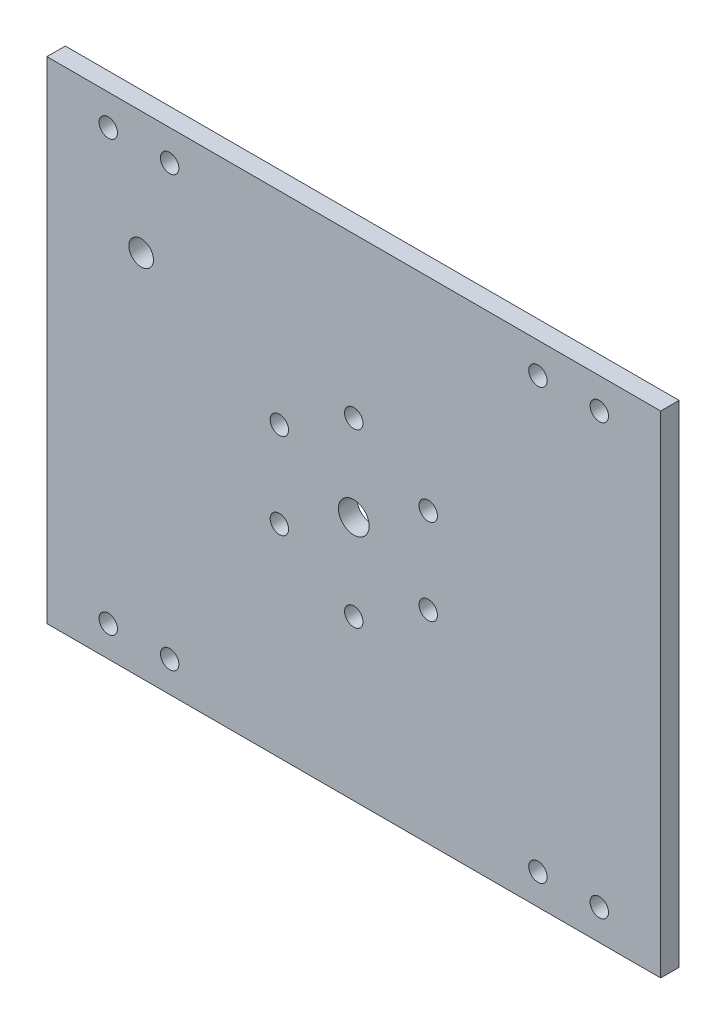
ISO-10303-21;
HEADER;
FILE_DESCRIPTION(('STEP AP214'),'2;1');
FILE_NAME('part.step','',(''),(''),'','','');
FILE_SCHEMA(('AUTOMOTIVE_DESIGN { 1 0 10303 214 1 1 1 1 }'));
ENDSEC;
DATA;
#1=APPLICATION_CONTEXT('core data for automotive mechanical design processes');
#2=APPLICATION_PROTOCOL_DEFINITION('international standard','automotive_design',2000,#1);
#3=PRODUCT_CONTEXT('',#1,'mechanical');
#4=PRODUCT('Part','Part','',(#3));
#5=PRODUCT_RELATED_PRODUCT_CATEGORY('part','',(#4));
#6=PRODUCT_DEFINITION_FORMATION('','',#4);
#7=PRODUCT_DEFINITION_CONTEXT('part definition',#1,'design');
#8=PRODUCT_DEFINITION('design','',#6,#7);
#9=PRODUCT_DEFINITION_SHAPE('','',#8);
#10=(LENGTH_UNIT() NAMED_UNIT(*) SI_UNIT(.MILLI.,.METRE.));
#11=(NAMED_UNIT(*) PLANE_ANGLE_UNIT() SI_UNIT($,.RADIAN.));
#12=(NAMED_UNIT(*) SI_UNIT($,.STERADIAN.) SOLID_ANGLE_UNIT());
#13=UNCERTAINTY_MEASURE_WITH_UNIT(LENGTH_MEASURE(1.E-05),#10,'distance_accuracy_value','');
#14=(GEOMETRIC_REPRESENTATION_CONTEXT(3) GLOBAL_UNCERTAINTY_ASSIGNED_CONTEXT((#13)) GLOBAL_UNIT_ASSIGNED_CONTEXT((#10,
#11,#12)) REPRESENTATION_CONTEXT('',''));
#15=CARTESIAN_POINT('',(0.,0.,0.));
#16=DIRECTION('',(0.,0.,1.));
#17=DIRECTION('',(1.,0.,0.));
#18=AXIS2_PLACEMENT_3D('',#15,#16,#17);
#19=CARTESIAN_POINT('',(0.,0.,3.));
#20=DIRECTION('',(0.,0.,1.));
#21=DIRECTION('',(1.,0.,0.));
#22=AXIS2_PLACEMENT_3D('',#19,#20,#21);
#23=PLANE('',#22);
#24=CARTESIAN_POINT('',(-34.6410161513775,20.0000000000001,3.));
#25=DIRECTION('',(0.,0.,-1.));
#26=DIRECTION('',(-1.,0.,0.));
#27=AXIS2_PLACEMENT_3D('',#24,#25,#26);
#28=CIRCLE('',#27,2.);
#29=CARTESIAN_POINT('',(-36.6410161513775,20.0000000000001,3.));
#30=VERTEX_POINT('',#29);
#31=EDGE_CURVE('E188',#30,#30,#28,.T.);
#32=ORIENTED_EDGE('',*,*,#31,.T.);
#33=EDGE_LOOP('',(#32));
#34=FACE_BOUND('',#33,.T.);
#35=CARTESIAN_POINT('',(30.,35.,3.));
#36=DIRECTION('',(0.,0.,1.));
#37=DIRECTION('',(1.,0.,0.));
#38=AXIS2_PLACEMENT_3D('',#35,#36,#37);
#39=CIRCLE('',#38,1.5);
#40=CARTESIAN_POINT('',(31.5,35.,3.));
#41=VERTEX_POINT('',#40);
#42=EDGE_CURVE('E162',#41,#41,#39,.T.);
#43=ORIENTED_EDGE('',*,*,#42,.F.);
#44=EDGE_LOOP('',(#43));
#45=FACE_BOUND('',#44,.T.);
#46=CARTESIAN_POINT('',(-30.,35.,3.));
#47=DIRECTION('',(0.,0.,1.));
#48=DIRECTION('',(1.,0.,0.));
#49=AXIS2_PLACEMENT_3D('',#46,#47,#48);
#50=CIRCLE('',#49,1.5);
#51=CARTESIAN_POINT('',(-28.5,35.,3.));
#52=VERTEX_POINT('',#51);
#53=EDGE_CURVE('E165',#52,#52,#50,.T.);
#54=ORIENTED_EDGE('',*,*,#53,.F.);
#55=EDGE_LOOP('',(#54));
#56=FACE_BOUND('',#55,.T.);
#57=CARTESIAN_POINT('',(-40.,35.,3.));
#58=DIRECTION('',(0.,0.,1.));
#59=DIRECTION('',(1.,0.,0.));
#60=AXIS2_PLACEMENT_3D('',#57,#58,#59);
#61=CIRCLE('',#60,1.5);
#62=CARTESIAN_POINT('',(-38.5,35.,3.));
#63=VERTEX_POINT('',#62);
#64=EDGE_CURVE('E168',#63,#63,#61,.T.);
#65=ORIENTED_EDGE('',*,*,#64,.F.);
#66=EDGE_LOOP('',(#65));
#67=FACE_BOUND('',#66,.T.);
#68=CARTESIAN_POINT('',(-40.,-35.,3.));
#69=DIRECTION('',(0.,0.,1.));
#70=DIRECTION('',(1.,0.,0.));
#71=AXIS2_PLACEMENT_3D('',#68,#69,#70);
#72=CIRCLE('',#71,1.5);
#73=CARTESIAN_POINT('',(-38.5,-35.,3.));
#74=VERTEX_POINT('',#73);
#75=EDGE_CURVE('E171',#74,#74,#72,.T.);
#76=ORIENTED_EDGE('',*,*,#75,.F.);
#77=EDGE_LOOP('',(#76));
#78=FACE_BOUND('',#77,.T.);
#79=CARTESIAN_POINT('',(-30.,-35.,3.));
#80=DIRECTION('',(0.,0.,1.));
#81=DIRECTION('',(1.,0.,0.));
#82=AXIS2_PLACEMENT_3D('',#79,#80,#81);
#83=CIRCLE('',#82,1.5);
#84=CARTESIAN_POINT('',(-28.5,-35.,3.));
#85=VERTEX_POINT('',#84);
#86=EDGE_CURVE('E174',#85,#85,#83,.T.);
#87=ORIENTED_EDGE('',*,*,#86,.F.);
#88=EDGE_LOOP('',(#87));
#89=FACE_BOUND('',#88,.T.);
#90=CARTESIAN_POINT('',(30.,-35.,3.));
#91=DIRECTION('',(0.,0.,1.));
#92=DIRECTION('',(1.,0.,0.));
#93=AXIS2_PLACEMENT_3D('',#90,#91,#92);
#94=CIRCLE('',#93,1.5);
#95=CARTESIAN_POINT('',(31.5,-35.,3.));
#96=VERTEX_POINT('',#95);
#97=EDGE_CURVE('E177',#96,#96,#94,.T.);
#98=ORIENTED_EDGE('',*,*,#97,.F.);
#99=EDGE_LOOP('',(#98));
#100=FACE_BOUND('',#99,.T.);
#101=CARTESIAN_POINT('',(40.,-35.,3.));
#102=DIRECTION('',(0.,0.,1.));
#103=DIRECTION('',(1.,0.,0.));
#104=AXIS2_PLACEMENT_3D('',#101,#102,#103);
#105=CIRCLE('',#104,1.5);
#106=CARTESIAN_POINT('',(41.5,-35.,3.));
#107=VERTEX_POINT('',#106);
#108=EDGE_CURVE('E180',#107,#107,#105,.T.);
#109=ORIENTED_EDGE('',*,*,#108,.F.);
#110=EDGE_LOOP('',(#109));
#111=FACE_BOUND('',#110,.T.);
#112=CARTESIAN_POINT('',(40.,35.,3.));
#113=DIRECTION('',(0.,0.,1.));
#114=DIRECTION('',(1.,0.,0.));
#115=AXIS2_PLACEMENT_3D('',#112,#113,#114);
#116=CIRCLE('',#115,1.5);
#117=CARTESIAN_POINT('',(41.5,35.,3.));
#118=VERTEX_POINT('',#117);
#119=EDGE_CURVE('E154',#118,#118,#116,.T.);
#120=ORIENTED_EDGE('',*,*,#119,.F.);
#121=EDGE_LOOP('',(#120));
#122=FACE_BOUND('',#121,.T.);
#123=CARTESIAN_POINT('',(-12.1243556529809,-7.00000000000069,3.));
#124=DIRECTION('',(0.,0.,1.));
#125=DIRECTION('',(1.,0.,0.));
#126=AXIS2_PLACEMENT_3D('',#123,#124,#125);
#127=CIRCLE('',#126,1.50000000000147);
#128=CARTESIAN_POINT('',(-10.6243556529795,-7.00000000000069,3.));
#129=VERTEX_POINT('',#128);
#130=EDGE_CURVE('E142',#129,#129,#127,.T.);
#131=ORIENTED_EDGE('',*,*,#130,.F.);
#132=EDGE_LOOP('',(#131));
#133=FACE_BOUND('',#132,.T.);
#134=CARTESIAN_POINT('',(12.1243556529833,-6.99999999999931,3.));
#135=DIRECTION('',(0.,0.,1.));
#136=DIRECTION('',(1.,0.,0.));
#137=AXIS2_PLACEMENT_3D('',#134,#135,#136);
#138=CIRCLE('',#137,1.500000000001);
#139=CARTESIAN_POINT('',(13.6243556529843,-6.99999999999931,3.));
#140=VERTEX_POINT('',#139);
#141=EDGE_CURVE('E130',#140,#140,#138,.T.);
#142=ORIENTED_EDGE('',*,*,#141,.F.);
#143=EDGE_LOOP('',(#142));
#144=FACE_BOUND('',#143,.T.);
#145=CARTESIAN_POINT('',(0.,0.,3.));
#146=DIRECTION('',(0.,0.,1.));
#147=DIRECTION('',(1.,0.,0.));
#148=AXIS2_PLACEMENT_3D('',#145,#146,#147);
#149=CIRCLE('',#148,2.5);
#150=CARTESIAN_POINT('',(2.5,0.,3.));
#151=VERTEX_POINT('',#150);
#152=EDGE_CURVE('E118',#151,#151,#149,.T.);
#153=ORIENTED_EDGE('',*,*,#152,.F.);
#154=EDGE_LOOP('',(#153));
#155=FACE_BOUND('',#154,.T.);
#156=DIRECTION('',(0.,1.,0.));
#157=VECTOR('',#156,1.);
#158=CARTESIAN_POINT('',(50.,40.,3.));
#159=LINE('',#158,#157);
#160=CARTESIAN_POINT('',(50.,-40.,3.));
#161=VERTEX_POINT('',#160);
#162=CARTESIAN_POINT('',(50.,40.,3.));
#163=VERTEX_POINT('',#162);
#164=EDGE_CURVE('E88',#161,#163,#159,.T.);
#165=ORIENTED_EDGE('',*,*,#164,.T.);
#166=DIRECTION('',(-1.,0.,0.));
#167=VECTOR('',#166,1.);
#168=CARTESIAN_POINT('',(-50.,40.,3.));
#169=LINE('',#168,#167);
#170=CARTESIAN_POINT('',(-50.,40.,3.));
#171=VERTEX_POINT('',#170);
#172=EDGE_CURVE('E83',#163,#171,#169,.T.);
#173=ORIENTED_EDGE('',*,*,#172,.T.);
#174=DIRECTION('',(0.,-1.,0.));
#175=VECTOR('',#174,1.);
#176=CARTESIAN_POINT('',(-50.,40.,3.));
#177=LINE('',#176,#175);
#178=CARTESIAN_POINT('',(-50.,-40.,3.));
#179=VERTEX_POINT('',#178);
#180=EDGE_CURVE('E86',#171,#179,#177,.T.);
#181=ORIENTED_EDGE('',*,*,#180,.T.);
#182=DIRECTION('',(1.,0.,0.));
#183=VECTOR('',#182,1.);
#184=CARTESIAN_POINT('',(-50.,-40.,3.));
#185=LINE('',#184,#183);
#186=EDGE_CURVE('E53',#179,#161,#185,.T.);
#187=ORIENTED_EDGE('',*,*,#186,.T.);
#188=EDGE_LOOP('',(#165,#173,#181,#187));
#189=FACE_BOUND('',#188,.T.);
#190=CARTESIAN_POINT('',(0.,14.,3.));
#191=DIRECTION('',(0.,0.,1.));
#192=DIRECTION('',(1.,0.,0.));
#193=AXIS2_PLACEMENT_3D('',#190,#191,#192);
#194=CIRCLE('',#193,1.5);
#195=CARTESIAN_POINT('',(1.5,14.,3.));
#196=VERTEX_POINT('',#195);
#197=EDGE_CURVE('E103',#196,#196,#194,.T.);
#198=ORIENTED_EDGE('',*,*,#197,.F.);
#199=EDGE_LOOP('',(#198));
#200=FACE_BOUND('',#199,.T.);
#201=CARTESIAN_POINT('',(12.1243556529822,6.99999999999997,3.));
#202=DIRECTION('',(0.,0.,1.));
#203=DIRECTION('',(1.,0.,0.));
#204=AXIS2_PLACEMENT_3D('',#201,#202,#203);
#205=CIRCLE('',#204,1.5);
#206=CARTESIAN_POINT('',(13.6243556529822,6.99999999999997,3.));
#207=VERTEX_POINT('',#206);
#208=EDGE_CURVE('E124',#207,#207,#205,.T.);
#209=ORIENTED_EDGE('',*,*,#208,.F.);
#210=EDGE_LOOP('',(#209));
#211=FACE_BOUND('',#210,.T.);
#212=CARTESIAN_POINT('',(1.58818671706501E-12,-14.,3.));
#213=DIRECTION('',(0.,0.,1.));
#214=DIRECTION('',(1.,0.,0.));
#215=AXIS2_PLACEMENT_3D('',#212,#213,#214);
#216=CIRCLE('',#215,1.50000000000161);
#217=CARTESIAN_POINT('',(1.5000000000032,-14.,3.));
#218=VERTEX_POINT('',#217);
#219=EDGE_CURVE('E136',#218,#218,#216,.T.);
#220=ORIENTED_EDGE('',*,*,#219,.F.);
#221=EDGE_LOOP('',(#220));
#222=FACE_BOUND('',#221,.T.);
#223=CARTESIAN_POINT('',(-12.1243556529821,7.00000000000014,3.));
#224=DIRECTION('',(0.,0.,1.));
#225=DIRECTION('',(1.,0.,0.));
#226=AXIS2_PLACEMENT_3D('',#223,#224,#225);
#227=CIRCLE('',#226,1.5);
#228=CARTESIAN_POINT('',(-10.6243556529821,7.00000000000014,3.));
#229=VERTEX_POINT('',#228);
#230=EDGE_CURVE('E148',#229,#229,#227,.T.);
#231=ORIENTED_EDGE('',*,*,#230,.F.);
#232=EDGE_LOOP('',(#231));
#233=FACE_BOUND('',#232,.T.);
#234=ADVANCED_FACE('F36',(#34,#45,#56,#67,#78,#89,#100,#111,#122,#133,#144,#155,#189,#200,#211,
#222,#233),#23,.T.);
#235=CARTESIAN_POINT('',(0.,0.,0.));
#236=DIRECTION('',(0.,0.,1.));
#237=DIRECTION('',(1.,0.,0.));
#238=AXIS2_PLACEMENT_3D('',#235,#236,#237);
#239=PLANE('',#238);
#240=CARTESIAN_POINT('',(-34.6410161513775,20.0000000000001,0.));
#241=DIRECTION('',(0.,0.,-1.));
#242=DIRECTION('',(-1.,0.,0.));
#243=AXIS2_PLACEMENT_3D('',#240,#241,#242);
#244=CIRCLE('',#243,2.);
#245=CARTESIAN_POINT('',(-36.6410161513775,20.0000000000001,0.));
#246=VERTEX_POINT('',#245);
#247=EDGE_CURVE('E205',#246,#246,#244,.T.);
#248=ORIENTED_EDGE('',*,*,#247,.F.);
#249=EDGE_LOOP('',(#248));
#250=FACE_BOUND('',#249,.T.);
#251=CARTESIAN_POINT('',(30.,35.,0.));
#252=DIRECTION('',(0.,0.,-1.));
#253=DIRECTION('',(-1.,0.,0.));
#254=AXIS2_PLACEMENT_3D('',#251,#252,#253);
#255=CIRCLE('',#254,1.5);
#256=CARTESIAN_POINT('',(28.5,35.,0.));
#257=VERTEX_POINT('',#256);
#258=EDGE_CURVE('E183',#257,#257,#255,.T.);
#259=ORIENTED_EDGE('',*,*,#258,.F.);
#260=EDGE_LOOP('',(#259));
#261=FACE_BOUND('',#260,.T.);
#262=CARTESIAN_POINT('',(-30.,35.,0.));
#263=DIRECTION('',(0.,0.,-1.));
#264=DIRECTION('',(1.,0.,0.));
#265=AXIS2_PLACEMENT_3D('',#262,#263,#264);
#266=CIRCLE('',#265,1.5);
#267=CARTESIAN_POINT('',(-28.5,35.,0.));
#268=VERTEX_POINT('',#267);
#269=EDGE_CURVE('E200',#268,#268,#266,.T.);
#270=ORIENTED_EDGE('',*,*,#269,.F.);
#271=EDGE_LOOP('',(#270));
#272=FACE_BOUND('',#271,.T.);
#273=CARTESIAN_POINT('',(-40.,35.,0.));
#274=DIRECTION('',(0.,0.,-1.));
#275=DIRECTION('',(1.,0.,0.));
#276=AXIS2_PLACEMENT_3D('',#273,#274,#275);
#277=CIRCLE('',#276,1.5);
#278=CARTESIAN_POINT('',(-38.5,35.,0.));
#279=VERTEX_POINT('',#278);
#280=EDGE_CURVE('E197',#279,#279,#277,.T.);
#281=ORIENTED_EDGE('',*,*,#280,.F.);
#282=EDGE_LOOP('',(#281));
#283=FACE_BOUND('',#282,.T.);
#284=CARTESIAN_POINT('',(-40.,-35.,0.));
#285=DIRECTION('',(0.,0.,-1.));
#286=DIRECTION('',(-1.,0.,0.));
#287=AXIS2_PLACEMENT_3D('',#284,#285,#286);
#288=CIRCLE('',#287,1.5);
#289=CARTESIAN_POINT('',(-41.5,-35.,0.));
#290=VERTEX_POINT('',#289);
#291=EDGE_CURVE('E194',#290,#290,#288,.T.);
#292=ORIENTED_EDGE('',*,*,#291,.F.);
#293=EDGE_LOOP('',(#292));
#294=FACE_BOUND('',#293,.T.);
#295=CARTESIAN_POINT('',(-30.,-35.,0.));
#296=DIRECTION('',(0.,0.,-1.));
#297=DIRECTION('',(-1.,0.,0.));
#298=AXIS2_PLACEMENT_3D('',#295,#296,#297);
#299=CIRCLE('',#298,1.5);
#300=CARTESIAN_POINT('',(-31.5,-35.,0.));
#301=VERTEX_POINT('',#300);
#302=EDGE_CURVE('E191',#301,#301,#299,.T.);
#303=ORIENTED_EDGE('',*,*,#302,.F.);
#304=EDGE_LOOP('',(#303));
#305=FACE_BOUND('',#304,.T.);
#306=CARTESIAN_POINT('',(30.,-35.,0.));
#307=DIRECTION('',(0.,0.,-1.));
#308=DIRECTION('',(1.,0.,0.));
#309=AXIS2_PLACEMENT_3D('',#306,#307,#308);
#310=CIRCLE('',#309,1.5);
#311=CARTESIAN_POINT('',(31.5,-35.,0.));
#312=VERTEX_POINT('',#311);
#313=EDGE_CURVE('E187',#312,#312,#310,.T.);
#314=ORIENTED_EDGE('',*,*,#313,.F.);
#315=EDGE_LOOP('',(#314));
#316=FACE_BOUND('',#315,.T.);
#317=CARTESIAN_POINT('',(40.,-35.,0.));
#318=DIRECTION('',(0.,0.,-1.));
#319=DIRECTION('',(1.,0.,0.));
#320=AXIS2_PLACEMENT_3D('',#317,#318,#319);
#321=CIRCLE('',#320,1.5);
#322=CARTESIAN_POINT('',(41.5,-35.,0.));
#323=VERTEX_POINT('',#322);
#324=EDGE_CURVE('E184',#323,#323,#321,.T.);
#325=ORIENTED_EDGE('',*,*,#324,.F.);
#326=EDGE_LOOP('',(#325));
#327=FACE_BOUND('',#326,.T.);
#328=CARTESIAN_POINT('',(40.,35.,0.));
#329=DIRECTION('',(0.,0.,-1.));
#330=DIRECTION('',(-1.,0.,0.));
#331=AXIS2_PLACEMENT_3D('',#328,#329,#330);
#332=CIRCLE('',#331,1.5);
#333=CARTESIAN_POINT('',(38.5,35.,0.));
#334=VERTEX_POINT('',#333);
#335=EDGE_CURVE('E159',#334,#334,#332,.T.);
#336=ORIENTED_EDGE('',*,*,#335,.F.);
#337=EDGE_LOOP('',(#336));
#338=FACE_BOUND('',#337,.T.);
#339=DIRECTION('',(0.,1.,0.));
#340=VECTOR('',#339,1.);
#341=CARTESIAN_POINT('',(50.,40.,0.));
#342=LINE('',#341,#340);
#343=CARTESIAN_POINT('',(50.,-40.,0.));
#344=VERTEX_POINT('',#343);
#345=CARTESIAN_POINT('',(50.,40.,0.));
#346=VERTEX_POINT('',#345);
#347=EDGE_CURVE('E100',#344,#346,#342,.T.);
#348=ORIENTED_EDGE('',*,*,#347,.F.);
#349=DIRECTION('',(1.,0.,0.));
#350=VECTOR('',#349,1.);
#351=CARTESIAN_POINT('',(-50.,-40.,0.));
#352=LINE('',#351,#350);
#353=CARTESIAN_POINT('',(-50.,-40.,0.));
#354=VERTEX_POINT('',#353);
#355=EDGE_CURVE('E76',#354,#344,#352,.T.);
#356=ORIENTED_EDGE('',*,*,#355,.F.);
#357=DIRECTION('',(0.,-1.,0.));
#358=VECTOR('',#357,1.);
#359=CARTESIAN_POINT('',(-50.,40.,0.));
#360=LINE('',#359,#358);
#361=CARTESIAN_POINT('',(-50.,40.,0.));
#362=VERTEX_POINT('',#361);
#363=EDGE_CURVE('E70',#362,#354,#360,.T.);
#364=ORIENTED_EDGE('',*,*,#363,.F.);
#365=DIRECTION('',(-1.,0.,0.));
#366=VECTOR('',#365,1.);
#367=CARTESIAN_POINT('',(-50.,40.,0.));
#368=LINE('',#367,#366);
#369=EDGE_CURVE('E92',#346,#362,#368,.T.);
#370=ORIENTED_EDGE('',*,*,#369,.F.);
#371=EDGE_LOOP('',(#348,#356,#364,#370));
#372=FACE_BOUND('',#371,.T.);
#373=CARTESIAN_POINT('',(0.,14.,0.));
#374=DIRECTION('',(0.,0.,1.));
#375=DIRECTION('',(1.,0.,0.));
#376=AXIS2_PLACEMENT_3D('',#373,#374,#375);
#377=CIRCLE('',#376,1.5);
#378=CARTESIAN_POINT('',(1.5,14.,0.));
#379=VERTEX_POINT('',#378);
#380=EDGE_CURVE('E115',#379,#379,#377,.T.);
#381=ORIENTED_EDGE('',*,*,#380,.T.);
#382=EDGE_LOOP('',(#381));
#383=FACE_BOUND('',#382,.T.);
#384=CARTESIAN_POINT('',(0.,0.,0.));
#385=DIRECTION('',(0.,0.,1.));
#386=DIRECTION('',(1.,0.,0.));
#387=AXIS2_PLACEMENT_3D('',#384,#385,#386);
#388=CIRCLE('',#387,2.5);
#389=CARTESIAN_POINT('',(2.5,0.,0.));
#390=VERTEX_POINT('',#389);
#391=EDGE_CURVE('E121',#390,#390,#388,.T.);
#392=ORIENTED_EDGE('',*,*,#391,.T.);
#393=EDGE_LOOP('',(#392));
#394=FACE_BOUND('',#393,.T.);
#395=CARTESIAN_POINT('',(12.1243556529822,6.99999999999997,0.));
#396=DIRECTION('',(0.,0.,1.));
#397=DIRECTION('',(1.,0.,0.));
#398=AXIS2_PLACEMENT_3D('',#395,#396,#397);
#399=CIRCLE('',#398,1.5);
#400=CARTESIAN_POINT('',(13.6243556529822,6.99999999999997,0.));
#401=VERTEX_POINT('',#400);
#402=EDGE_CURVE('E127',#401,#401,#399,.T.);
#403=ORIENTED_EDGE('',*,*,#402,.T.);
#404=EDGE_LOOP('',(#403));
#405=FACE_BOUND('',#404,.T.);
#406=CARTESIAN_POINT('',(12.1243556529833,-6.99999999999931,0.));
#407=DIRECTION('',(0.,0.,1.));
#408=DIRECTION('',(1.,0.,0.));
#409=AXIS2_PLACEMENT_3D('',#406,#407,#408);
#410=CIRCLE('',#409,1.500000000001);
#411=CARTESIAN_POINT('',(13.6243556529843,-6.99999999999931,0.));
#412=VERTEX_POINT('',#411);
#413=EDGE_CURVE('E133',#412,#412,#410,.T.);
#414=ORIENTED_EDGE('',*,*,#413,.T.);
#415=EDGE_LOOP('',(#414));
#416=FACE_BOUND('',#415,.T.);
#417=CARTESIAN_POINT('',(1.58818671706501E-12,-14.,0.));
#418=DIRECTION('',(0.,0.,1.));
#419=DIRECTION('',(1.,0.,0.));
#420=AXIS2_PLACEMENT_3D('',#417,#418,#419);
#421=CIRCLE('',#420,1.50000000000161);
#422=CARTESIAN_POINT('',(1.5000000000032,-14.,0.));
#423=VERTEX_POINT('',#422);
#424=EDGE_CURVE('E139',#423,#423,#421,.T.);
#425=ORIENTED_EDGE('',*,*,#424,.T.);
#426=EDGE_LOOP('',(#425));
#427=FACE_BOUND('',#426,.T.);
#428=CARTESIAN_POINT('',(-12.1243556529809,-7.00000000000069,0.));
#429=DIRECTION('',(0.,0.,1.));
#430=DIRECTION('',(1.,0.,0.));
#431=AXIS2_PLACEMENT_3D('',#428,#429,#430);
#432=CIRCLE('',#431,1.50000000000147);
#433=CARTESIAN_POINT('',(-10.6243556529795,-7.00000000000069,0.));
#434=VERTEX_POINT('',#433);
#435=EDGE_CURVE('E145',#434,#434,#432,.T.);
#436=ORIENTED_EDGE('',*,*,#435,.T.);
#437=EDGE_LOOP('',(#436));
#438=FACE_BOUND('',#437,.T.);
#439=CARTESIAN_POINT('',(-12.1243556529821,7.00000000000014,0.));
#440=DIRECTION('',(0.,0.,1.));
#441=DIRECTION('',(1.,0.,0.));
#442=AXIS2_PLACEMENT_3D('',#439,#440,#441);
#443=CIRCLE('',#442,1.5);
#444=CARTESIAN_POINT('',(-10.6243556529821,7.00000000000014,0.));
#445=VERTEX_POINT('',#444);
#446=EDGE_CURVE('E151',#445,#445,#443,.T.);
#447=ORIENTED_EDGE('',*,*,#446,.T.);
#448=EDGE_LOOP('',(#447));
#449=FACE_BOUND('',#448,.T.);
#450=ADVANCED_FACE('F111',(#250,#261,#272,#283,#294,#305,#316,#327,#338,#372,#383,#394,#405,
#416,#427,#438,#449),#239,.F.);
#451=CARTESIAN_POINT('',(50.,40.,3.));
#452=DIRECTION('',(-1.,0.,0.));
#453=DIRECTION('',(0.,0.,1.));
#454=AXIS2_PLACEMENT_3D('',#451,#452,#453);
#455=PLANE('',#454);
#456=ORIENTED_EDGE('',*,*,#347,.T.);
#457=DIRECTION('',(0.,0.,-1.));
#458=VECTOR('',#457,1.);
#459=CARTESIAN_POINT('',(50.,40.,3.));
#460=LINE('',#459,#458);
#461=EDGE_CURVE('E11',#163,#346,#460,.T.);
#462=ORIENTED_EDGE('',*,*,#461,.F.);
#463=ORIENTED_EDGE('',*,*,#164,.F.);
#464=DIRECTION('',(0.,0.,-1.));
#465=VECTOR('',#464,1.);
#466=CARTESIAN_POINT('',(50.,-40.,3.));
#467=LINE('',#466,#465);
#468=EDGE_CURVE('E96',#161,#344,#467,.T.);
#469=ORIENTED_EDGE('',*,*,#468,.T.);
#470=EDGE_LOOP('',(#456,#462,#463,#469));
#471=FACE_BOUND('',#470,.T.);
#472=ADVANCED_FACE('F38',(#471),#455,.F.);
#473=CARTESIAN_POINT('',(-50.,40.,3.));
#474=DIRECTION('',(0.,-1.,0.));
#475=DIRECTION('',(0.,0.,-1.));
#476=AXIS2_PLACEMENT_3D('',#473,#474,#475);
#477=PLANE('',#476);
#478=ORIENTED_EDGE('',*,*,#369,.T.);
#479=DIRECTION('',(0.,0.,-1.));
#480=VECTOR('',#479,1.);
#481=CARTESIAN_POINT('',(-50.,40.,3.));
#482=LINE('',#481,#480);
#483=EDGE_CURVE('E45',#171,#362,#482,.T.);
#484=ORIENTED_EDGE('',*,*,#483,.F.);
#485=ORIENTED_EDGE('',*,*,#172,.F.);
#486=ORIENTED_EDGE('',*,*,#461,.T.);
#487=EDGE_LOOP('',(#478,#484,#485,#486));
#488=FACE_BOUND('',#487,.T.);
#489=ADVANCED_FACE('F91',(#488),#477,.F.);
#490=CARTESIAN_POINT('',(-50.,40.,3.));
#491=DIRECTION('',(1.,0.,0.));
#492=DIRECTION('',(0.,0.,-1.));
#493=AXIS2_PLACEMENT_3D('',#490,#491,#492);
#494=PLANE('',#493);
#495=ORIENTED_EDGE('',*,*,#363,.T.);
#496=DIRECTION('',(0.,0.,-1.));
#497=VECTOR('',#496,1.);
#498=CARTESIAN_POINT('',(-50.,-40.,3.));
#499=LINE('',#498,#497);
#500=EDGE_CURVE('E93',#179,#354,#499,.T.);
#501=ORIENTED_EDGE('',*,*,#500,.F.);
#502=ORIENTED_EDGE('',*,*,#180,.F.);
#503=ORIENTED_EDGE('',*,*,#483,.T.);
#504=EDGE_LOOP('',(#495,#501,#502,#503));
#505=FACE_BOUND('',#504,.T.);
#506=ADVANCED_FACE('F94',(#505),#494,.F.);
#507=CARTESIAN_POINT('',(-50.,-40.,3.));
#508=DIRECTION('',(0.,1.,0.));
#509=DIRECTION('',(0.,0.,1.));
#510=AXIS2_PLACEMENT_3D('',#507,#508,#509);
#511=PLANE('',#510);
#512=ORIENTED_EDGE('',*,*,#355,.T.);
#513=ORIENTED_EDGE('',*,*,#468,.F.);
#514=ORIENTED_EDGE('',*,*,#186,.F.);
#515=ORIENTED_EDGE('',*,*,#500,.T.);
#516=EDGE_LOOP('',(#512,#513,#514,#515));
#517=FACE_BOUND('',#516,.T.);
#518=ADVANCED_FACE('F108',(#517),#511,.F.);
#519=CARTESIAN_POINT('',(0.,14.,3.));
#520=DIRECTION('',(0.,0.,-1.));
#521=DIRECTION('',(-1.,0.,0.));
#522=AXIS2_PLACEMENT_3D('',#519,#520,#521);
#523=CYLINDRICAL_SURFACE('',#522,1.5);
#524=ORIENTED_EDGE('',*,*,#197,.T.);
#525=EDGE_LOOP('',(#524));
#526=FACE_BOUND('',#525,.T.);
#527=ORIENTED_EDGE('',*,*,#380,.F.);
#528=EDGE_LOOP('',(#527));
#529=FACE_BOUND('',#528,.T.);
#530=ADVANCED_FACE('F260',(#526,#529),#523,.F.);
#531=CARTESIAN_POINT('',(0.,0.,3.));
#532=DIRECTION('',(0.,0.,-1.));
#533=DIRECTION('',(-1.,0.,0.));
#534=AXIS2_PLACEMENT_3D('',#531,#532,#533);
#535=CYLINDRICAL_SURFACE('',#534,2.5);
#536=ORIENTED_EDGE('',*,*,#152,.T.);
#537=EDGE_LOOP('',(#536));
#538=FACE_BOUND('',#537,.T.);
#539=ORIENTED_EDGE('',*,*,#391,.F.);
#540=EDGE_LOOP('',(#539));
#541=FACE_BOUND('',#540,.T.);
#542=ADVANCED_FACE('F385',(#538,#541),#535,.F.);
#543=CARTESIAN_POINT('',(12.1243556529822,6.99999999999997,3.));
#544=DIRECTION('',(0.,0.,-1.));
#545=DIRECTION('',(-1.,0.,0.));
#546=AXIS2_PLACEMENT_3D('',#543,#544,#545);
#547=CYLINDRICAL_SURFACE('',#546,1.5);
#548=ORIENTED_EDGE('',*,*,#208,.T.);
#549=EDGE_LOOP('',(#548));
#550=FACE_BOUND('',#549,.T.);
#551=ORIENTED_EDGE('',*,*,#402,.F.);
#552=EDGE_LOOP('',(#551));
#553=FACE_BOUND('',#552,.T.);
#554=ADVANCED_FACE('F375',(#550,#553),#547,.F.);
#555=CARTESIAN_POINT('',(12.1243556529833,-6.99999999999931,3.));
#556=DIRECTION('',(0.,0.,-1.));
#557=DIRECTION('',(-1.,0.,0.));
#558=AXIS2_PLACEMENT_3D('',#555,#556,#557);
#559=CYLINDRICAL_SURFACE('',#558,1.500000000001);
#560=ORIENTED_EDGE('',*,*,#141,.T.);
#561=EDGE_LOOP('',(#560));
#562=FACE_BOUND('',#561,.T.);
#563=ORIENTED_EDGE('',*,*,#413,.F.);
#564=EDGE_LOOP('',(#563));
#565=FACE_BOUND('',#564,.T.);
#566=ADVANCED_FACE('F365',(#562,#565),#559,.F.);
#567=CARTESIAN_POINT('',(1.58818671706501E-12,-14.,3.));
#568=DIRECTION('',(0.,0.,-1.));
#569=DIRECTION('',(-1.,0.,0.));
#570=AXIS2_PLACEMENT_3D('',#567,#568,#569);
#571=CYLINDRICAL_SURFACE('',#570,1.50000000000161);
#572=ORIENTED_EDGE('',*,*,#219,.T.);
#573=EDGE_LOOP('',(#572));
#574=FACE_BOUND('',#573,.T.);
#575=ORIENTED_EDGE('',*,*,#424,.F.);
#576=EDGE_LOOP('',(#575));
#577=FACE_BOUND('',#576,.T.);
#578=ADVANCED_FACE('F355',(#574,#577),#571,.F.);
#579=CARTESIAN_POINT('',(-12.1243556529809,-7.00000000000069,3.));
#580=DIRECTION('',(0.,0.,-1.));
#581=DIRECTION('',(-1.,0.,0.));
#582=AXIS2_PLACEMENT_3D('',#579,#580,#581);
#583=CYLINDRICAL_SURFACE('',#582,1.50000000000147);
#584=ORIENTED_EDGE('',*,*,#130,.T.);
#585=EDGE_LOOP('',(#584));
#586=FACE_BOUND('',#585,.T.);
#587=ORIENTED_EDGE('',*,*,#435,.F.);
#588=EDGE_LOOP('',(#587));
#589=FACE_BOUND('',#588,.T.);
#590=ADVANCED_FACE('F252',(#586,#589),#583,.F.);
#591=CARTESIAN_POINT('',(-12.1243556529821,7.00000000000014,3.));
#592=DIRECTION('',(0.,0.,-1.));
#593=DIRECTION('',(-1.,0.,0.));
#594=AXIS2_PLACEMENT_3D('',#591,#592,#593);
#595=CYLINDRICAL_SURFACE('',#594,1.5);
#596=ORIENTED_EDGE('',*,*,#230,.T.);
#597=EDGE_LOOP('',(#596));
#598=FACE_BOUND('',#597,.T.);
#599=ORIENTED_EDGE('',*,*,#446,.F.);
#600=EDGE_LOOP('',(#599));
#601=FACE_BOUND('',#600,.T.);
#602=ADVANCED_FACE('F242',(#598,#601),#595,.F.);
#603=CARTESIAN_POINT('',(40.,35.,10.));
#604=DIRECTION('',(0.,0.,-1.));
#605=DIRECTION('',(-1.,0.,0.));
#606=AXIS2_PLACEMENT_3D('',#603,#604,#605);
#607=CYLINDRICAL_SURFACE('',#606,1.5);
#608=ORIENTED_EDGE('',*,*,#119,.T.);
#609=EDGE_LOOP('',(#608));
#610=FACE_BOUND('',#609,.T.);
#611=ORIENTED_EDGE('',*,*,#335,.T.);
#612=EDGE_LOOP('',(#611));
#613=FACE_BOUND('',#612,.T.);
#614=ADVANCED_FACE('F239',(#610,#613),#607,.F.);
#615=CARTESIAN_POINT('',(40.,-35.,10.));
#616=DIRECTION('',(0.,0.,-1.));
#617=DIRECTION('',(-1.,0.,0.));
#618=AXIS2_PLACEMENT_3D('',#615,#616,#617);
#619=CYLINDRICAL_SURFACE('',#618,1.5);
#620=ORIENTED_EDGE('',*,*,#108,.T.);
#621=EDGE_LOOP('',(#620));
#622=FACE_BOUND('',#621,.T.);
#623=ORIENTED_EDGE('',*,*,#324,.T.);
#624=EDGE_LOOP('',(#623));
#625=FACE_BOUND('',#624,.T.);
#626=ADVANCED_FACE('F241',(#622,#625),#619,.F.);
#627=CARTESIAN_POINT('',(30.,-35.,10.));
#628=DIRECTION('',(0.,0.,-1.));
#629=DIRECTION('',(-1.,0.,0.));
#630=AXIS2_PLACEMENT_3D('',#627,#628,#629);
#631=CYLINDRICAL_SURFACE('',#630,1.5);
#632=ORIENTED_EDGE('',*,*,#97,.T.);
#633=EDGE_LOOP('',(#632));
#634=FACE_BOUND('',#633,.T.);
#635=ORIENTED_EDGE('',*,*,#313,.T.);
#636=EDGE_LOOP('',(#635));
#637=FACE_BOUND('',#636,.T.);
#638=ADVANCED_FACE('F249',(#634,#637),#631,.F.);
#639=CARTESIAN_POINT('',(-30.,-35.,10.));
#640=DIRECTION('',(0.,0.,-1.));
#641=DIRECTION('',(-1.,0.,0.));
#642=AXIS2_PLACEMENT_3D('',#639,#640,#641);
#643=CYLINDRICAL_SURFACE('',#642,1.5);
#644=ORIENTED_EDGE('',*,*,#86,.T.);
#645=EDGE_LOOP('',(#644));
#646=FACE_BOUND('',#645,.T.);
#647=ORIENTED_EDGE('',*,*,#302,.T.);
#648=EDGE_LOOP('',(#647));
#649=FACE_BOUND('',#648,.T.);
#650=ADVANCED_FACE('F316',(#646,#649),#643,.F.);
#651=CARTESIAN_POINT('',(-40.,-35.,10.));
#652=DIRECTION('',(0.,0.,-1.));
#653=DIRECTION('',(-1.,0.,0.));
#654=AXIS2_PLACEMENT_3D('',#651,#652,#653);
#655=CYLINDRICAL_SURFACE('',#654,1.5);
#656=ORIENTED_EDGE('',*,*,#75,.T.);
#657=EDGE_LOOP('',(#656));
#658=FACE_BOUND('',#657,.T.);
#659=ORIENTED_EDGE('',*,*,#291,.T.);
#660=EDGE_LOOP('',(#659));
#661=FACE_BOUND('',#660,.T.);
#662=ADVANCED_FACE('F308',(#658,#661),#655,.F.);
#663=CARTESIAN_POINT('',(-40.,35.,10.));
#664=DIRECTION('',(0.,0.,-1.));
#665=DIRECTION('',(-1.,0.,0.));
#666=AXIS2_PLACEMENT_3D('',#663,#664,#665);
#667=CYLINDRICAL_SURFACE('',#666,1.5);
#668=ORIENTED_EDGE('',*,*,#64,.T.);
#669=EDGE_LOOP('',(#668));
#670=FACE_BOUND('',#669,.T.);
#671=ORIENTED_EDGE('',*,*,#280,.T.);
#672=EDGE_LOOP('',(#671));
#673=FACE_BOUND('',#672,.T.);
#674=ADVANCED_FACE('F300',(#670,#673),#667,.F.);
#675=CARTESIAN_POINT('',(-30.,35.,10.));
#676=DIRECTION('',(0.,0.,-1.));
#677=DIRECTION('',(-1.,0.,0.));
#678=AXIS2_PLACEMENT_3D('',#675,#676,#677);
#679=CYLINDRICAL_SURFACE('',#678,1.5);
#680=ORIENTED_EDGE('',*,*,#53,.T.);
#681=EDGE_LOOP('',(#680));
#682=FACE_BOUND('',#681,.T.);
#683=ORIENTED_EDGE('',*,*,#269,.T.);
#684=EDGE_LOOP('',(#683));
#685=FACE_BOUND('',#684,.T.);
#686=ADVANCED_FACE('F293',(#682,#685),#679,.F.);
#687=CARTESIAN_POINT('',(30.,35.,10.));
#688=DIRECTION('',(0.,0.,-1.));
#689=DIRECTION('',(-1.,0.,0.));
#690=AXIS2_PLACEMENT_3D('',#687,#688,#689);
#691=CYLINDRICAL_SURFACE('',#690,1.5);
#692=ORIENTED_EDGE('',*,*,#42,.T.);
#693=EDGE_LOOP('',(#692));
#694=FACE_BOUND('',#693,.T.);
#695=ORIENTED_EDGE('',*,*,#258,.T.);
#696=EDGE_LOOP('',(#695));
#697=FACE_BOUND('',#696,.T.);
#698=ADVANCED_FACE('F216',(#694,#697),#691,.F.);
#699=CARTESIAN_POINT('',(-34.6410161513775,20.0000000000001,3.));
#700=DIRECTION('',(0.,0.,-1.));
#701=DIRECTION('',(-1.,0.,0.));
#702=AXIS2_PLACEMENT_3D('',#699,#700,#701);
#703=CYLINDRICAL_SURFACE('',#702,2.);
#704=ORIENTED_EDGE('',*,*,#31,.F.);
#705=EDGE_LOOP('',(#704));
#706=FACE_BOUND('',#705,.T.);
#707=ORIENTED_EDGE('',*,*,#247,.T.);
#708=EDGE_LOOP('',(#707));
#709=FACE_BOUND('',#708,.T.);
#710=ADVANCED_FACE('F213',(#706,#709),#703,.F.);
#711=CLOSED_SHELL('',(#234,#450,#472,#489,#506,#518,#530,#542,#554,#566,#578,#590,#602,#614,
#626,#638,#650,#662,#674,#686,#698,#710));
#712=MANIFOLD_SOLID_BREP('B2',#711);
#713=ADVANCED_BREP_SHAPE_REPRESENTATION('',(#18,#712),#14);
#714=SHAPE_DEFINITION_REPRESENTATION(#9,#713);
ENDSEC;
END-ISO-10303-21;
